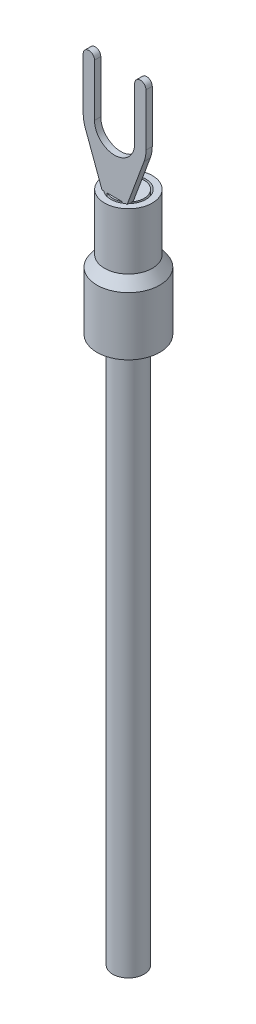
ISO-10303-21;
HEADER;
FILE_DESCRIPTION(('STEP AP214'),'2;1');
FILE_NAME('part.step','',(''),(''),'','','');
FILE_SCHEMA(('AUTOMOTIVE_DESIGN { 1 0 10303 214 1 1 1 1 }'));
ENDSEC;
DATA;
#1=APPLICATION_CONTEXT('core data for automotive mechanical design processes');
#2=APPLICATION_PROTOCOL_DEFINITION('international standard','automotive_design',2000,#1);
#3=PRODUCT_CONTEXT('',#1,'mechanical');
#4=PRODUCT('Part','Part','',(#3));
#5=PRODUCT_RELATED_PRODUCT_CATEGORY('part','',(#4));
#6=PRODUCT_DEFINITION_FORMATION('','',#4);
#7=PRODUCT_DEFINITION_CONTEXT('part definition',#1,'design');
#8=PRODUCT_DEFINITION('design','',#6,#7);
#9=PRODUCT_DEFINITION_SHAPE('','',#8);
#10=(LENGTH_UNIT() NAMED_UNIT(*) SI_UNIT(.MILLI.,.METRE.));
#11=(NAMED_UNIT(*) PLANE_ANGLE_UNIT() SI_UNIT($,.RADIAN.));
#12=(NAMED_UNIT(*) SI_UNIT($,.STERADIAN.) SOLID_ANGLE_UNIT());
#13=UNCERTAINTY_MEASURE_WITH_UNIT(LENGTH_MEASURE(1.E-05),#10,'distance_accuracy_value','');
#14=(GEOMETRIC_REPRESENTATION_CONTEXT(3) GLOBAL_UNCERTAINTY_ASSIGNED_CONTEXT((#13)) GLOBAL_UNIT_ASSIGNED_CONTEXT((#10,
#11,#12)) REPRESENTATION_CONTEXT('',''));
#15=CARTESIAN_POINT('',(0.,0.,0.));
#16=DIRECTION('',(0.,0.,1.));
#17=DIRECTION('',(1.,0.,0.));
#18=AXIS2_PLACEMENT_3D('',#15,#16,#17);
#19=CARTESIAN_POINT('',(-2.34452059505099,-0.867884312210892,0.5));
#20=DIRECTION('',(0.937808238020394,0.347153724884357,0.));
#21=DIRECTION('',(-0.347153724884357,0.937808238020394,0.));
#22=AXIS2_PLACEMENT_3D('',#19,#20,#21);
#23=PLANE('',#22);
#24=DIRECTION('',(0.,0.,1.));
#25=VECTOR('',#24,1.);
#26=CARTESIAN_POINT('',(-1.,-4.5,0.499999999999999));
#27=LINE('',#26,#25);
#28=CARTESIAN_POINT('',(-1.,-4.5,0.));
#29=VERTEX_POINT('',#28);
#30=CARTESIAN_POINT('',(-1.,-4.5,0.150000000000001));
#31=VERTEX_POINT('',#30);
#32=EDGE_CURVE('E185',#29,#31,#27,.T.);
#33=ORIENTED_EDGE('',*,*,#32,.T.);
#34=CARTESIAN_POINT('',(0.,-7.20142064105116,-0.6));
#35=DIRECTION('',(0.937808238020394,0.347153724884357,0.));
#36=DIRECTION('',(-0.347153724884357,0.937808238020394,0.));
#37=AXIS2_PLACEMENT_3D('',#34,#35,#36);
#38=ELLIPSE('',#37,3.60071032052557,1.25);
#39=CARTESIAN_POINT('',(-0.593717104351883,-5.59754100040986,0.500000000000003));
#40=VERTEX_POINT('',#39);
#41=EDGE_CURVE('E193',#31,#40,#38,.T.);
#42=ORIENTED_EDGE('',*,*,#41,.T.);
#43=DIRECTION('',(0.347153724884357,-0.937808238020394,0.));
#44=VECTOR('',#43,1.);
#45=CARTESIAN_POINT('',(-2.34452059505099,-0.867884312210892,0.5));
#46=LINE('',#45,#44);
#47=CARTESIAN_POINT('',(-0.866025403784439,-4.86192173959321,0.5));
#48=VERTEX_POINT('',#47);
#49=EDGE_CURVE('E273',#48,#40,#46,.T.);
#50=ORIENTED_EDGE('',*,*,#49,.F.);
#51=CARTESIAN_POINT('',(0.,-7.20142064105115,-0.6));
#52=DIRECTION('',(0.937808238020394,0.347153724884357,0.));
#53=DIRECTION('',(-0.347153724884357,0.937808238020394,0.));
#54=AXIS2_PLACEMENT_3D('',#51,#52,#53);
#55=ELLIPSE('',#54,4.03279555898864,1.4);
#56=CARTESIAN_POINT('',(-1.,-4.5,0.379795897113272));
#57=VERTEX_POINT('',#56);
#58=EDGE_CURVE('E55',#57,#48,#55,.T.);
#59=ORIENTED_EDGE('',*,*,#58,.F.);
#60=DIRECTION('',(0.,0.,-1.));
#61=VECTOR('',#60,1.);
#62=CARTESIAN_POINT('',(-1.,-4.5,0.499999999999999));
#63=LINE('',#62,#61);
#64=CARTESIAN_POINT('',(-1.,-4.5,0.5));
#65=VERTEX_POINT('',#64);
#66=EDGE_CURVE('E228',#65,#57,#63,.T.);
#67=ORIENTED_EDGE('',*,*,#66,.F.);
#68=CARTESIAN_POINT('',(-2.34452059505099,-0.867884312210892,0.5));
#69=VERTEX_POINT('',#68);
#70=EDGE_CURVE('E274',#69,#65,#46,.T.);
#71=ORIENTED_EDGE('',*,*,#70,.F.);
#72=DIRECTION('',(0.,0.,-1.));
#73=VECTOR('',#72,1.);
#74=CARTESIAN_POINT('',(-2.34452059505099,-0.867884312210892,0.5));
#75=LINE('',#74,#73);
#76=CARTESIAN_POINT('',(-2.34452059505099,-0.867884312210892,0.));
#77=VERTEX_POINT('',#76);
#78=EDGE_CURVE('E277',#69,#77,#75,.T.);
#79=ORIENTED_EDGE('',*,*,#78,.T.);
#80=DIRECTION('',(0.347153724884357,-0.937808238020394,0.));
#81=VECTOR('',#80,1.);
#82=CARTESIAN_POINT('',(-2.34452059505099,-0.867884312210892,0.));
#83=LINE('',#82,#81);
#84=EDGE_CURVE('E266',#77,#29,#83,.T.);
#85=ORIENTED_EDGE('',*,*,#84,.T.);
#86=EDGE_LOOP('',(#33,#42,#50,#59,#67,#71,#79,#85));
#87=FACE_BOUND('',#86,.T.);
#88=ADVANCED_FACE('F39',(#87),#23,.F.);
#89=CARTESIAN_POINT('',(0.,0.,0.5));
#90=DIRECTION('',(0.,0.,1.));
#91=DIRECTION('',(1.,0.,0.));
#92=AXIS2_PLACEMENT_3D('',#89,#90,#91);
#93=PLANE('',#92);
#94=DIRECTION('',(0.,1.,0.));
#95=VECTOR('',#94,1.);
#96=CARTESIAN_POINT('',(0.593717104351885,-58.,0.5));
#97=LINE('',#96,#95);
#98=CARTESIAN_POINT('',(0.593717104351896,-5.59754100040982,0.5));
#99=VERTEX_POINT('',#98);
#100=CARTESIAN_POINT('',(0.593717104351898,-4.5,0.5));
#101=VERTEX_POINT('',#100);
#102=EDGE_CURVE('E165',#99,#101,#97,.T.);
#103=ORIENTED_EDGE('',*,*,#102,.F.);
#104=DIRECTION('',(-0.347153724884357,-0.937808238020394,0.));
#105=VECTOR('',#104,1.);
#106=CARTESIAN_POINT('',(2.34452059505099,-0.867884312210892,0.5));
#107=LINE('',#106,#105);
#108=CARTESIAN_POINT('',(0.86602540378444,-4.86192173959321,0.5));
#109=VERTEX_POINT('',#108);
#110=EDGE_CURVE('E235',#109,#99,#107,.T.);
#111=ORIENTED_EDGE('',*,*,#110,.F.);
#112=DIRECTION('',(0.,1.,0.));
#113=VECTOR('',#112,1.);
#114=CARTESIAN_POINT('',(0.866025403784439,-5.56785615600206,0.5));
#115=LINE('',#114,#113);
#116=CARTESIAN_POINT('',(0.866025403784439,-4.5,0.5));
#117=VERTEX_POINT('',#116);
#118=EDGE_CURVE('E62',#109,#117,#115,.T.);
#119=ORIENTED_EDGE('',*,*,#118,.T.);
#120=DIRECTION('',(1.,0.,0.));
#121=VECTOR('',#120,1.);
#122=CARTESIAN_POINT('',(0.,-4.5,0.5));
#123=LINE('',#122,#121);
#124=CARTESIAN_POINT('',(1.,-4.5,0.5));
#125=VERTEX_POINT('',#124);
#126=EDGE_CURVE('E224',#117,#125,#123,.T.);
#127=ORIENTED_EDGE('',*,*,#126,.T.);
#128=CARTESIAN_POINT('',(2.34452059505099,-0.867884312210892,0.5));
#129=VERTEX_POINT('',#128);
#130=EDGE_CURVE('E231',#129,#125,#107,.T.);
#131=ORIENTED_EDGE('',*,*,#130,.F.);
#132=CARTESIAN_POINT('',(0.,0.,0.5));
#133=DIRECTION('',(0.,0.,-1.));
#134=DIRECTION('',(-1.,0.,0.));
#135=AXIS2_PLACEMENT_3D('',#132,#133,#134);
#136=CIRCLE('',#135,2.5);
#137=CARTESIAN_POINT('',(2.5,0.,0.5));
#138=VERTEX_POINT('',#137);
#139=EDGE_CURVE('E234',#138,#129,#136,.T.);
#140=ORIENTED_EDGE('',*,*,#139,.F.);
#141=DIRECTION('',(0.,-1.,0.));
#142=VECTOR('',#141,1.);
#143=CARTESIAN_POINT('',(2.5,0.,0.5));
#144=LINE('',#143,#142);
#145=CARTESIAN_POINT('',(2.5,4.15,0.5));
#146=VERTEX_POINT('',#145);
#147=EDGE_CURVE('E238',#146,#138,#144,.T.);
#148=ORIENTED_EDGE('',*,*,#147,.F.);
#149=CARTESIAN_POINT('',(2.05,4.15,0.5));
#150=DIRECTION('',(0.,0.,1.));
#151=DIRECTION('',(1.,0.,0.));
#152=AXIS2_PLACEMENT_3D('',#149,#150,#151);
#153=CIRCLE('',#152,0.45);
#154=CARTESIAN_POINT('',(1.6,4.15,0.5));
#155=VERTEX_POINT('',#154);
#156=EDGE_CURVE('E313',#146,#155,#153,.T.);
#157=ORIENTED_EDGE('',*,*,#156,.T.);
#158=DIRECTION('',(0.,1.,0.));
#159=VECTOR('',#158,1.);
#160=CARTESIAN_POINT('',(1.6,0.,0.5));
#161=LINE('',#160,#159);
#162=CARTESIAN_POINT('',(1.6,0.,0.5));
#163=VERTEX_POINT('',#162);
#164=EDGE_CURVE('E240',#163,#155,#161,.T.);
#165=ORIENTED_EDGE('',*,*,#164,.F.);
#166=CARTESIAN_POINT('',(0.,0.,0.5));
#167=DIRECTION('',(0.,0.,-1.));
#168=DIRECTION('',(1.,0.,0.));
#169=AXIS2_PLACEMENT_3D('',#166,#167,#168);
#170=CIRCLE('',#169,1.6);
#171=CARTESIAN_POINT('',(-1.6,0.,0.5));
#172=VERTEX_POINT('',#171);
#173=EDGE_CURVE('E262',#163,#172,#170,.T.);
#174=ORIENTED_EDGE('',*,*,#173,.T.);
#175=DIRECTION('',(0.,1.,0.));
#176=VECTOR('',#175,1.);
#177=CARTESIAN_POINT('',(-1.6,0.,0.5));
#178=LINE('',#177,#176);
#179=CARTESIAN_POINT('',(-1.6,4.15,0.5));
#180=VERTEX_POINT('',#179);
#181=EDGE_CURVE('E265',#172,#180,#178,.T.);
#182=ORIENTED_EDGE('',*,*,#181,.T.);
#183=CARTESIAN_POINT('',(-2.05,4.15,0.5));
#184=DIRECTION('',(0.,0.,1.));
#185=DIRECTION('',(1.,0.,0.));
#186=AXIS2_PLACEMENT_3D('',#183,#184,#185);
#187=CIRCLE('',#186,0.45);
#188=CARTESIAN_POINT('',(-2.5,4.15,0.5));
#189=VERTEX_POINT('',#188);
#190=EDGE_CURVE('E305',#180,#189,#187,.T.);
#191=ORIENTED_EDGE('',*,*,#190,.T.);
#192=DIRECTION('',(0.,-1.,0.));
#193=VECTOR('',#192,1.);
#194=CARTESIAN_POINT('',(-2.5,0.,0.5));
#195=LINE('',#194,#193);
#196=CARTESIAN_POINT('',(-2.5,0.,0.5));
#197=VERTEX_POINT('',#196);
#198=EDGE_CURVE('E269',#189,#197,#195,.T.);
#199=ORIENTED_EDGE('',*,*,#198,.T.);
#200=CARTESIAN_POINT('',(0.,0.,0.5));
#201=DIRECTION('',(0.,0.,1.));
#202=DIRECTION('',(1.,0.,0.));
#203=AXIS2_PLACEMENT_3D('',#200,#201,#202);
#204=CIRCLE('',#203,2.5);
#205=EDGE_CURVE('E271',#197,#69,#204,.T.);
#206=ORIENTED_EDGE('',*,*,#205,.T.);
#207=ORIENTED_EDGE('',*,*,#70,.T.);
#208=CARTESIAN_POINT('',(-0.866025403784439,-4.5,0.5));
#209=VERTEX_POINT('',#208);
#210=EDGE_CURVE('E227',#65,#209,#123,.T.);
#211=ORIENTED_EDGE('',*,*,#210,.T.);
#212=DIRECTION('',(0.,1.,0.));
#213=VECTOR('',#212,1.);
#214=CARTESIAN_POINT('',(-0.866025403784439,-5.56785615600206,0.5));
#215=LINE('',#214,#213);
#216=EDGE_CURVE('E221',#209,#48,#215,.F.);
#217=ORIENTED_EDGE('',*,*,#216,.T.);
#218=ORIENTED_EDGE('',*,*,#49,.T.);
#219=DIRECTION('',(0.,1.,0.));
#220=VECTOR('',#219,1.);
#221=CARTESIAN_POINT('',(-0.593717104351885,-58.,0.5));
#222=LINE('',#221,#220);
#223=CARTESIAN_POINT('',(-0.593717104351898,-4.5,0.5));
#224=VERTEX_POINT('',#223);
#225=EDGE_CURVE('E176',#224,#40,#222,.F.);
#226=ORIENTED_EDGE('',*,*,#225,.F.);
#227=DIRECTION('',(-1.,0.,0.));
#228=VECTOR('',#227,1.);
#229=CARTESIAN_POINT('',(0.,-4.5,0.5));
#230=LINE('',#229,#228);
#231=EDGE_CURVE('E177',#101,#224,#230,.T.);
#232=ORIENTED_EDGE('',*,*,#231,.F.);
#233=EDGE_LOOP('',(#103,#111,#119,#127,#131,#140,#148,#157,#165,#174,#182,#191,#199,#206,#207,
#211,#217,#218,#226,#232));
#234=FACE_BOUND('',#233,.T.);
#235=ADVANCED_FACE('F183',(#234),#93,.T.);
#236=CARTESIAN_POINT('',(2.34452059505099,-0.867884312210892,0.5));
#237=DIRECTION('',(0.937808238020394,-0.347153724884357,0.));
#238=DIRECTION('',(0.347153724884357,0.937808238020394,0.));
#239=AXIS2_PLACEMENT_3D('',#236,#237,#238);
#240=PLANE('',#239);
#241=CARTESIAN_POINT('',(0.,-7.20142064105116,-0.6));
#242=DIRECTION('',(0.937808238020394,-0.347153724884357,0.));
#243=DIRECTION('',(0.347153724884357,0.937808238020394,0.));
#244=AXIS2_PLACEMENT_3D('',#241,#242,#243);
#245=ELLIPSE('',#244,3.60071032052557,1.25);
#246=CARTESIAN_POINT('',(1.,-4.5,0.150000000000001));
#247=VERTEX_POINT('',#246);
#248=EDGE_CURVE('E11',#247,#99,#245,.T.);
#249=ORIENTED_EDGE('',*,*,#248,.F.);
#250=DIRECTION('',(0.,0.,1.));
#251=VECTOR('',#250,1.);
#252=CARTESIAN_POINT('',(1.,-4.5,0.499999999999999));
#253=LINE('',#252,#251);
#254=CARTESIAN_POINT('',(0.999999999999996,-4.5,0.));
#255=VERTEX_POINT('',#254);
#256=EDGE_CURVE('E188',#255,#247,#253,.T.);
#257=ORIENTED_EDGE('',*,*,#256,.F.);
#258=DIRECTION('',(-0.347153724884357,-0.937808238020394,0.));
#259=VECTOR('',#258,1.);
#260=CARTESIAN_POINT('',(2.34452059505099,-0.867884312210892,0.));
#261=LINE('',#260,#259);
#262=CARTESIAN_POINT('',(2.34452059505099,-0.867884312210892,0.));
#263=VERTEX_POINT('',#262);
#264=EDGE_CURVE('E230',#263,#255,#261,.T.);
#265=ORIENTED_EDGE('',*,*,#264,.F.);
#266=DIRECTION('',(0.,0.,-1.));
#267=VECTOR('',#266,1.);
#268=CARTESIAN_POINT('',(2.34452059505099,-0.867884312210892,0.5));
#269=LINE('',#268,#267);
#270=EDGE_CURVE('E259',#129,#263,#269,.T.);
#271=ORIENTED_EDGE('',*,*,#270,.F.);
#272=ORIENTED_EDGE('',*,*,#130,.T.);
#273=DIRECTION('',(0.,0.,-1.));
#274=VECTOR('',#273,1.);
#275=CARTESIAN_POINT('',(1.,-4.5,0.499999999999999));
#276=LINE('',#275,#274);
#277=CARTESIAN_POINT('',(1.,-4.5,0.379795897113272));
#278=VERTEX_POINT('',#277);
#279=EDGE_CURVE('E48',#125,#278,#276,.T.);
#280=ORIENTED_EDGE('',*,*,#279,.T.);
#281=CARTESIAN_POINT('',(0.,-7.20142064105115,-0.6));
#282=DIRECTION('',(0.937808238020394,-0.347153724884357,0.));
#283=DIRECTION('',(0.347153724884357,0.937808238020394,0.));
#284=AXIS2_PLACEMENT_3D('',#281,#282,#283);
#285=ELLIPSE('',#284,4.03279555898864,1.4);
#286=EDGE_CURVE('E317',#278,#109,#285,.T.);
#287=ORIENTED_EDGE('',*,*,#286,.T.);
#288=ORIENTED_EDGE('',*,*,#110,.T.);
#289=EDGE_LOOP('',(#249,#257,#265,#271,#272,#280,#287,#288));
#290=FACE_BOUND('',#289,.T.);
#291=ADVANCED_FACE('F320',(#290),#240,.T.);
#292=CARTESIAN_POINT('',(2.05,4.15,0.5));
#293=DIRECTION('',(0.,0.,-1.));
#294=DIRECTION('',(-1.,0.,0.));
#295=AXIS2_PLACEMENT_3D('',#292,#293,#294);
#296=CYLINDRICAL_SURFACE('',#295,0.45);
#297=DIRECTION('',(0.,0.,-1.));
#298=VECTOR('',#297,1.);
#299=CARTESIAN_POINT('',(1.6,4.15,0.5));
#300=LINE('',#299,#298);
#301=CARTESIAN_POINT('',(1.6,4.15,0.));
#302=VERTEX_POINT('',#301);
#303=EDGE_CURVE('E307',#155,#302,#300,.T.);
#304=ORIENTED_EDGE('',*,*,#303,.F.);
#305=ORIENTED_EDGE('',*,*,#156,.F.);
#306=DIRECTION('',(0.,0.,-1.));
#307=VECTOR('',#306,1.);
#308=CARTESIAN_POINT('',(2.5,4.15,0.5));
#309=LINE('',#308,#307);
#310=CARTESIAN_POINT('',(2.5,4.15,0.));
#311=VERTEX_POINT('',#310);
#312=EDGE_CURVE('E310',#311,#146,#309,.F.);
#313=ORIENTED_EDGE('',*,*,#312,.F.);
#314=CARTESIAN_POINT('',(2.05,4.15,0.));
#315=DIRECTION('',(0.,0.,1.));
#316=DIRECTION('',(1.,0.,0.));
#317=AXIS2_PLACEMENT_3D('',#314,#315,#316);
#318=CIRCLE('',#317,0.45);
#319=EDGE_CURVE('E315',#302,#311,#318,.F.);
#320=ORIENTED_EDGE('',*,*,#319,.F.);
#321=EDGE_LOOP('',(#304,#305,#313,#320));
#322=FACE_BOUND('',#321,.T.);
#323=ADVANCED_FACE('F42',(#322),#296,.T.);
#324=CARTESIAN_POINT('',(-2.05,4.15,0.));
#325=DIRECTION('',(0.,0.,-1.));
#326=DIRECTION('',(-1.,0.,0.));
#327=AXIS2_PLACEMENT_3D('',#324,#325,#326);
#328=CYLINDRICAL_SURFACE('',#327,0.45);
#329=DIRECTION('',(0.,0.,-1.));
#330=VECTOR('',#329,1.);
#331=CARTESIAN_POINT('',(-1.6,4.15,0.5));
#332=LINE('',#331,#330);
#333=CARTESIAN_POINT('',(-1.6,4.15,0.));
#334=VERTEX_POINT('',#333);
#335=EDGE_CURVE('E297',#334,#180,#332,.F.);
#336=ORIENTED_EDGE('',*,*,#335,.F.);
#337=CARTESIAN_POINT('',(-2.05,4.15,0.));
#338=DIRECTION('',(0.,0.,1.));
#339=DIRECTION('',(1.,0.,0.));
#340=AXIS2_PLACEMENT_3D('',#337,#338,#339);
#341=CIRCLE('',#340,0.45);
#342=CARTESIAN_POINT('',(-2.5,4.15,0.));
#343=VERTEX_POINT('',#342);
#344=EDGE_CURVE('E303',#343,#334,#341,.F.);
#345=ORIENTED_EDGE('',*,*,#344,.F.);
#346=DIRECTION('',(0.,0.,-1.));
#347=VECTOR('',#346,1.);
#348=CARTESIAN_POINT('',(-2.5,4.15,0.5));
#349=LINE('',#348,#347);
#350=EDGE_CURVE('E300',#189,#343,#349,.T.);
#351=ORIENTED_EDGE('',*,*,#350,.F.);
#352=ORIENTED_EDGE('',*,*,#190,.F.);
#353=EDGE_LOOP('',(#336,#345,#351,#352));
#354=FACE_BOUND('',#353,.T.);
#355=ADVANCED_FACE('F359',(#354),#328,.T.);
#356=CARTESIAN_POINT('',(0.,0.,0.5));
#357=DIRECTION('',(0.,0.,-1.));
#358=DIRECTION('',(-1.,0.,0.));
#359=AXIS2_PLACEMENT_3D('',#356,#357,#358);
#360=CYLINDRICAL_SURFACE('',#359,1.6);
#361=CARTESIAN_POINT('',(0.,0.,0.));
#362=DIRECTION('',(0.,0.,-1.));
#363=DIRECTION('',(1.,0.,0.));
#364=AXIS2_PLACEMENT_3D('',#361,#362,#363);
#365=CIRCLE('',#364,1.6);
#366=CARTESIAN_POINT('',(1.6,0.,0.));
#367=VERTEX_POINT('',#366);
#368=CARTESIAN_POINT('',(-1.6,0.,0.));
#369=VERTEX_POINT('',#368);
#370=EDGE_CURVE('E261',#367,#369,#365,.T.);
#371=ORIENTED_EDGE('',*,*,#370,.T.);
#372=DIRECTION('',(0.,0.,-1.));
#373=VECTOR('',#372,1.);
#374=CARTESIAN_POINT('',(-1.6,0.,0.5));
#375=LINE('',#374,#373);
#376=EDGE_CURVE('E294',#172,#369,#375,.T.);
#377=ORIENTED_EDGE('',*,*,#376,.F.);
#378=ORIENTED_EDGE('',*,*,#173,.F.);
#379=DIRECTION('',(0.,0.,-1.));
#380=VECTOR('',#379,1.);
#381=CARTESIAN_POINT('',(1.6,0.,0.5));
#382=LINE('',#381,#380);
#383=EDGE_CURVE('E243',#163,#367,#382,.T.);
#384=ORIENTED_EDGE('',*,*,#383,.T.);
#385=EDGE_LOOP('',(#371,#377,#378,#384));
#386=FACE_BOUND('',#385,.T.);
#387=ADVANCED_FACE('F354',(#386),#360,.F.);
#388=CARTESIAN_POINT('',(-1.6,0.,0.5));
#389=DIRECTION('',(-1.,0.,0.));
#390=DIRECTION('',(0.,0.,1.));
#391=AXIS2_PLACEMENT_3D('',#388,#389,#390);
#392=PLANE('',#391);
#393=DIRECTION('',(0.,1.,0.));
#394=VECTOR('',#393,1.);
#395=CARTESIAN_POINT('',(-1.6,0.,0.));
#396=LINE('',#395,#394);
#397=EDGE_CURVE('E280',#369,#334,#396,.T.);
#398=ORIENTED_EDGE('',*,*,#397,.T.);
#399=ORIENTED_EDGE('',*,*,#335,.T.);
#400=ORIENTED_EDGE('',*,*,#181,.F.);
#401=ORIENTED_EDGE('',*,*,#376,.T.);
#402=EDGE_LOOP('',(#398,#399,#400,#401));
#403=FACE_BOUND('',#402,.T.);
#404=ADVANCED_FACE('F356',(#403),#392,.F.);
#405=CARTESIAN_POINT('',(-2.5,0.,0.5));
#406=DIRECTION('',(1.,0.,0.));
#407=DIRECTION('',(0.,0.,-1.));
#408=AXIS2_PLACEMENT_3D('',#405,#406,#407);
#409=PLANE('',#408);
#410=ORIENTED_EDGE('',*,*,#198,.F.);
#411=ORIENTED_EDGE('',*,*,#350,.T.);
#412=DIRECTION('',(0.,-1.,0.));
#413=VECTOR('',#412,1.);
#414=CARTESIAN_POINT('',(-2.5,0.,0.));
#415=LINE('',#414,#413);
#416=CARTESIAN_POINT('',(-2.5,0.,0.));
#417=VERTEX_POINT('',#416);
#418=EDGE_CURVE('E283',#343,#417,#415,.T.);
#419=ORIENTED_EDGE('',*,*,#418,.T.);
#420=DIRECTION('',(0.,0.,-1.));
#421=VECTOR('',#420,1.);
#422=CARTESIAN_POINT('',(-2.5,0.,0.5));
#423=LINE('',#422,#421);
#424=EDGE_CURVE('E291',#197,#417,#423,.T.);
#425=ORIENTED_EDGE('',*,*,#424,.F.);
#426=EDGE_LOOP('',(#410,#411,#419,#425));
#427=FACE_BOUND('',#426,.T.);
#428=ADVANCED_FACE('F366',(#427),#409,.F.);
#429=CARTESIAN_POINT('',(0.,0.,0.5));
#430=DIRECTION('',(0.,0.,-1.));
#431=DIRECTION('',(-1.,0.,0.));
#432=AXIS2_PLACEMENT_3D('',#429,#430,#431);
#433=CYLINDRICAL_SURFACE('',#432,2.5);
#434=CARTESIAN_POINT('',(0.,0.,0.));
#435=DIRECTION('',(0.,0.,1.));
#436=DIRECTION('',(1.,0.,0.));
#437=AXIS2_PLACEMENT_3D('',#434,#435,#436);
#438=CIRCLE('',#437,2.5);
#439=EDGE_CURVE('E285',#417,#77,#438,.T.);
#440=ORIENTED_EDGE('',*,*,#439,.T.);
#441=ORIENTED_EDGE('',*,*,#78,.F.);
#442=ORIENTED_EDGE('',*,*,#205,.F.);
#443=ORIENTED_EDGE('',*,*,#424,.T.);
#444=EDGE_LOOP('',(#440,#441,#442,#443));
#445=FACE_BOUND('',#444,.T.);
#446=ADVANCED_FACE('F370',(#445),#433,.T.);
#447=CARTESIAN_POINT('',(0.,0.,0.));
#448=DIRECTION('',(0.,0.,1.));
#449=DIRECTION('',(1.,0.,0.));
#450=AXIS2_PLACEMENT_3D('',#447,#448,#449);
#451=PLANE('',#450);
#452=ORIENTED_EDGE('',*,*,#264,.T.);
#453=DIRECTION('',(-1.,0.,0.));
#454=VECTOR('',#453,1.);
#455=CARTESIAN_POINT('',(0.,-4.5,0.));
#456=LINE('',#455,#454);
#457=EDGE_CURVE('E331',#255,#29,#456,.T.);
#458=ORIENTED_EDGE('',*,*,#457,.T.);
#459=ORIENTED_EDGE('',*,*,#84,.F.);
#460=ORIENTED_EDGE('',*,*,#439,.F.);
#461=ORIENTED_EDGE('',*,*,#418,.F.);
#462=ORIENTED_EDGE('',*,*,#344,.T.);
#463=ORIENTED_EDGE('',*,*,#397,.F.);
#464=ORIENTED_EDGE('',*,*,#370,.F.);
#465=DIRECTION('',(0.,1.,0.));
#466=VECTOR('',#465,1.);
#467=CARTESIAN_POINT('',(1.6,0.,0.));
#468=LINE('',#467,#466);
#469=EDGE_CURVE('E251',#367,#302,#468,.T.);
#470=ORIENTED_EDGE('',*,*,#469,.T.);
#471=ORIENTED_EDGE('',*,*,#319,.T.);
#472=DIRECTION('',(0.,-1.,0.));
#473=VECTOR('',#472,1.);
#474=CARTESIAN_POINT('',(2.5,0.,0.));
#475=LINE('',#474,#473);
#476=CARTESIAN_POINT('',(2.5,0.,0.));
#477=VERTEX_POINT('',#476);
#478=EDGE_CURVE('E249',#311,#477,#475,.T.);
#479=ORIENTED_EDGE('',*,*,#478,.T.);
#480=CARTESIAN_POINT('',(0.,0.,0.));
#481=DIRECTION('',(0.,0.,-1.));
#482=DIRECTION('',(-1.,0.,0.));
#483=AXIS2_PLACEMENT_3D('',#480,#481,#482);
#484=CIRCLE('',#483,2.5);
#485=EDGE_CURVE('E246',#477,#263,#484,.T.);
#486=ORIENTED_EDGE('',*,*,#485,.T.);
#487=EDGE_LOOP('',(#452,#458,#459,#460,#461,#462,#463,#464,#470,#471,#479,#486));
#488=FACE_BOUND('',#487,.T.);
#489=ADVANCED_FACE('F334',(#488),#451,.F.);
#490=CARTESIAN_POINT('',(0.,0.,0.5));
#491=DIRECTION('',(0.,0.,-1.));
#492=DIRECTION('',(-1.,0.,0.));
#493=AXIS2_PLACEMENT_3D('',#490,#491,#492);
#494=CYLINDRICAL_SURFACE('',#493,2.5);
#495=ORIENTED_EDGE('',*,*,#485,.F.);
#496=DIRECTION('',(0.,0.,-1.));
#497=VECTOR('',#496,1.);
#498=CARTESIAN_POINT('',(2.5,0.,0.5));
#499=LINE('',#498,#497);
#500=EDGE_CURVE('E256',#138,#477,#499,.T.);
#501=ORIENTED_EDGE('',*,*,#500,.F.);
#502=ORIENTED_EDGE('',*,*,#139,.T.);
#503=ORIENTED_EDGE('',*,*,#270,.T.);
#504=EDGE_LOOP('',(#495,#501,#502,#503));
#505=FACE_BOUND('',#504,.T.);
#506=ADVANCED_FACE('F340',(#505),#494,.T.);
#507=CARTESIAN_POINT('',(2.5,0.,0.5));
#508=DIRECTION('',(1.,0.,0.));
#509=DIRECTION('',(0.,0.,-1.));
#510=AXIS2_PLACEMENT_3D('',#507,#508,#509);
#511=PLANE('',#510);
#512=ORIENTED_EDGE('',*,*,#478,.F.);
#513=ORIENTED_EDGE('',*,*,#312,.T.);
#514=ORIENTED_EDGE('',*,*,#147,.T.);
#515=ORIENTED_EDGE('',*,*,#500,.T.);
#516=EDGE_LOOP('',(#512,#513,#514,#515));
#517=FACE_BOUND('',#516,.T.);
#518=ADVANCED_FACE('F345',(#517),#511,.T.);
#519=CARTESIAN_POINT('',(1.6,0.,0.5));
#520=DIRECTION('',(-1.,0.,0.));
#521=DIRECTION('',(0.,0.,1.));
#522=AXIS2_PLACEMENT_3D('',#519,#520,#521);
#523=PLANE('',#522);
#524=ORIENTED_EDGE('',*,*,#164,.T.);
#525=ORIENTED_EDGE('',*,*,#303,.T.);
#526=ORIENTED_EDGE('',*,*,#469,.F.);
#527=ORIENTED_EDGE('',*,*,#383,.F.);
#528=EDGE_LOOP('',(#524,#525,#526,#527));
#529=FACE_BOUND('',#528,.T.);
#530=ADVANCED_FACE('F351',(#529),#523,.T.);
#531=CARTESIAN_POINT('',(0.,-4.5,-2.5));
#532=DIRECTION('',(0.,-1.,0.));
#533=DIRECTION('',(0.,0.,-1.));
#534=AXIS2_PLACEMENT_3D('',#531,#532,#533);
#535=PLANE('',#534);
#536=CARTESIAN_POINT('',(0.,-4.5,-0.599999999999999));
#537=DIRECTION('',(0.,1.,0.));
#538=DIRECTION('',(0.,0.,1.));
#539=AXIS2_PLACEMENT_3D('',#536,#537,#538);
#540=CIRCLE('',#539,1.9);
#541=CARTESIAN_POINT('',(0.,-4.5,1.3));
#542=VERTEX_POINT('',#541);
#543=EDGE_CURVE('E196',#542,#542,#540,.T.);
#544=ORIENTED_EDGE('',*,*,#543,.T.);
#545=EDGE_LOOP('',(#544));
#546=FACE_BOUND('',#545,.T.);
#547=ORIENTED_EDGE('',*,*,#210,.F.);
#548=ORIENTED_EDGE('',*,*,#66,.T.);
#549=CARTESIAN_POINT('',(0.,-4.5,-0.599999999999999));
#550=DIRECTION('',(0.,1.,0.));
#551=DIRECTION('',(0.,0.,1.));
#552=AXIS2_PLACEMENT_3D('',#549,#550,#551);
#553=CIRCLE('',#552,1.4);
#554=EDGE_CURVE('E219',#278,#57,#553,.T.);
#555=ORIENTED_EDGE('',*,*,#554,.F.);
#556=ORIENTED_EDGE('',*,*,#279,.F.);
#557=ORIENTED_EDGE('',*,*,#126,.F.);
#558=EDGE_CURVE('E217',#209,#117,#553,.T.);
#559=ORIENTED_EDGE('',*,*,#558,.F.);
#560=EDGE_LOOP('',(#547,#548,#555,#556,#557,#559));
#561=FACE_BOUND('',#560,.T.);
#562=ADVANCED_FACE('F324',(#546,#561),#535,.F.);
#563=CARTESIAN_POINT('',(0.,-5.56785615600206,-0.599999999999999));
#564=DIRECTION('',(0.,1.,0.));
#565=DIRECTION('',(0.,0.,1.));
#566=AXIS2_PLACEMENT_3D('',#563,#564,#565);
#567=CYLINDRICAL_SURFACE('',#566,1.4);
#568=CARTESIAN_POINT('',(0.,-9.1616925927975,-0.6));
#569=DIRECTION('',(0.,1.,0.));
#570=DIRECTION('',(0.,0.,1.));
#571=AXIS2_PLACEMENT_3D('',#568,#569,#570);
#572=CIRCLE('',#571,1.4);
#573=CARTESIAN_POINT('',(0.,-9.1616925927975,0.8));
#574=VERTEX_POINT('',#573);
#575=EDGE_CURVE('E214',#574,#574,#572,.T.);
#576=ORIENTED_EDGE('',*,*,#575,.F.);
#577=EDGE_LOOP('',(#576));
#578=FACE_BOUND('',#577,.T.);
#579=ORIENTED_EDGE('',*,*,#554,.T.);
#580=ORIENTED_EDGE('',*,*,#58,.T.);
#581=ORIENTED_EDGE('',*,*,#216,.F.);
#582=ORIENTED_EDGE('',*,*,#558,.T.);
#583=ORIENTED_EDGE('',*,*,#118,.F.);
#584=ORIENTED_EDGE('',*,*,#286,.F.);
#585=EDGE_LOOP('',(#579,#580,#581,#582,#583,#584));
#586=FACE_BOUND('',#585,.T.);
#587=ADVANCED_FACE('F376',(#578,#586),#567,.F.);
#588=CARTESIAN_POINT('',(0.,-9.1616925927975,-0.6));
#589=DIRECTION('',(0.,-1.,0.));
#590=DIRECTION('',(0.,0.,-1.));
#591=AXIS2_PLACEMENT_3D('',#588,#589,#590);
#592=CONICAL_SURFACE('',#591,1.4,0.610865238198019);
#593=CARTESIAN_POINT('',(0.,-10.0185813968428,-0.6));
#594=DIRECTION('',(0.,1.,0.));
#595=DIRECTION('',(0.,0.,1.));
#596=AXIS2_PLACEMENT_3D('',#593,#594,#595);
#597=CIRCLE('',#596,2.);
#598=CARTESIAN_POINT('',(0.,-10.0185813968428,1.4));
#599=VERTEX_POINT('',#598);
#600=EDGE_CURVE('E211',#599,#599,#597,.T.);
#601=ORIENTED_EDGE('',*,*,#600,.F.);
#602=EDGE_LOOP('',(#601));
#603=FACE_BOUND('',#602,.T.);
#604=ORIENTED_EDGE('',*,*,#575,.T.);
#605=EDGE_LOOP('',(#604));
#606=FACE_BOUND('',#605,.T.);
#607=ADVANCED_FACE('F378',(#603,#606),#592,.F.);
#608=CARTESIAN_POINT('',(0.,-5.56785615600206,-0.599999999999999));
#609=DIRECTION('',(0.,1.,0.));
#610=DIRECTION('',(0.,0.,1.));
#611=AXIS2_PLACEMENT_3D('',#608,#609,#610);
#612=CYLINDRICAL_SURFACE('',#611,2.);
#613=CARTESIAN_POINT('',(0.,-14.5,-0.6));
#614=DIRECTION('',(0.,1.,0.));
#615=DIRECTION('',(0.,0.,1.));
#616=AXIS2_PLACEMENT_3D('',#613,#614,#615);
#617=CIRCLE('',#616,2.);
#618=CARTESIAN_POINT('',(0.,-14.5,1.4));
#619=VERTEX_POINT('',#618);
#620=EDGE_CURVE('E208',#619,#619,#617,.T.);
#621=ORIENTED_EDGE('',*,*,#620,.F.);
#622=EDGE_LOOP('',(#621));
#623=FACE_BOUND('',#622,.T.);
#624=ORIENTED_EDGE('',*,*,#600,.T.);
#625=EDGE_LOOP('',(#624));
#626=FACE_BOUND('',#625,.T.);
#627=ADVANCED_FACE('F385',(#623,#626),#612,.F.);
#628=CARTESIAN_POINT('',(0.,-14.5,-3.1));
#629=DIRECTION('',(0.,1.,0.));
#630=DIRECTION('',(0.,0.,1.));
#631=AXIS2_PLACEMENT_3D('',#628,#629,#630);
#632=PLANE('',#631);
#633=CARTESIAN_POINT('',(0.,-14.5,-0.6));
#634=DIRECTION('',(0.,1.,0.));
#635=DIRECTION('',(0.,0.,1.));
#636=AXIS2_PLACEMENT_3D('',#633,#634,#635);
#637=CIRCLE('',#636,2.5);
#638=CARTESIAN_POINT('',(0.,-14.5,1.9));
#639=VERTEX_POINT('',#638);
#640=EDGE_CURVE('E205',#639,#639,#637,.T.);
#641=ORIENTED_EDGE('',*,*,#640,.F.);
#642=EDGE_LOOP('',(#641));
#643=FACE_BOUND('',#642,.T.);
#644=ORIENTED_EDGE('',*,*,#620,.T.);
#645=EDGE_LOOP('',(#644));
#646=FACE_BOUND('',#645,.T.);
#647=ADVANCED_FACE('F456',(#643,#646),#632,.F.);
#648=CARTESIAN_POINT('',(0.,-5.56785615600206,-0.599999999999999));
#649=DIRECTION('',(0.,1.,0.));
#650=DIRECTION('',(0.,0.,1.));
#651=AXIS2_PLACEMENT_3D('',#648,#649,#650);
#652=CYLINDRICAL_SURFACE('',#651,2.5);
#653=CARTESIAN_POINT('',(0.,-9.86093200240327,-0.6));
#654=DIRECTION('',(0.,1.,0.));
#655=DIRECTION('',(0.,0.,1.));
#656=AXIS2_PLACEMENT_3D('',#653,#654,#655);
#657=CIRCLE('',#656,2.5);
#658=CARTESIAN_POINT('',(0.,-9.86093200240327,1.9));
#659=VERTEX_POINT('',#658);
#660=EDGE_CURVE('E202',#659,#659,#657,.T.);
#661=ORIENTED_EDGE('',*,*,#660,.F.);
#662=EDGE_LOOP('',(#661));
#663=FACE_BOUND('',#662,.T.);
#664=ORIENTED_EDGE('',*,*,#640,.T.);
#665=EDGE_LOOP('',(#664));
#666=FACE_BOUND('',#665,.T.);
#667=ADVANCED_FACE('F466',(#663,#666),#652,.T.);
#668=CARTESIAN_POINT('',(0.,-9.86093200240327,-0.6));
#669=DIRECTION('',(0.,-1.,0.));
#670=DIRECTION('',(0.,0.,-1.));
#671=AXIS2_PLACEMENT_3D('',#668,#669,#670);
#672=CONICAL_SURFACE('',#671,2.5,0.610865238198019);
#673=CARTESIAN_POINT('',(0.,-9.004043198358,-0.6));
#674=DIRECTION('',(0.,1.,0.));
#675=DIRECTION('',(0.,0.,1.));
#676=AXIS2_PLACEMENT_3D('',#673,#674,#675);
#677=CIRCLE('',#676,1.9);
#678=CARTESIAN_POINT('',(0.,-9.004043198358,1.3));
#679=VERTEX_POINT('',#678);
#680=EDGE_CURVE('E199',#679,#679,#677,.T.);
#681=ORIENTED_EDGE('',*,*,#680,.F.);
#682=EDGE_LOOP('',(#681));
#683=FACE_BOUND('',#682,.T.);
#684=ORIENTED_EDGE('',*,*,#660,.T.);
#685=EDGE_LOOP('',(#684));
#686=FACE_BOUND('',#685,.T.);
#687=ADVANCED_FACE('F476',(#683,#686),#672,.T.);
#688=CARTESIAN_POINT('',(0.,-5.56785615600206,-0.599999999999999));
#689=DIRECTION('',(0.,1.,0.));
#690=DIRECTION('',(0.,0.,1.));
#691=AXIS2_PLACEMENT_3D('',#688,#689,#690);
#692=CYLINDRICAL_SURFACE('',#691,1.9);
#693=ORIENTED_EDGE('',*,*,#543,.F.);
#694=EDGE_LOOP('',(#693));
#695=FACE_BOUND('',#694,.T.);
#696=ORIENTED_EDGE('',*,*,#680,.T.);
#697=EDGE_LOOP('',(#696));
#698=FACE_BOUND('',#697,.T.);
#699=ADVANCED_FACE('F486',(#695,#698),#692,.T.);
#700=CARTESIAN_POINT('',(0.,-58.,-0.600000000000006));
#701=DIRECTION('',(0.,1.,0.));
#702=DIRECTION('',(0.,0.,1.));
#703=AXIS2_PLACEMENT_3D('',#700,#701,#702);
#704=CYLINDRICAL_SURFACE('',#703,1.25);
#705=CARTESIAN_POINT('',(0.,-58.,-0.600000000000006));
#706=DIRECTION('',(0.,1.,0.));
#707=DIRECTION('',(0.,0.,1.));
#708=AXIS2_PLACEMENT_3D('',#705,#706,#707);
#709=CIRCLE('',#708,1.25);
#710=CARTESIAN_POINT('',(0.,-58.,0.649999999999994));
#711=VERTEX_POINT('',#710);
#712=EDGE_CURVE('E565',#711,#711,#709,.T.);
#713=ORIENTED_EDGE('',*,*,#712,.T.);
#714=EDGE_LOOP('',(#713));
#715=FACE_BOUND('',#714,.T.);
#716=ORIENTED_EDGE('',*,*,#41,.F.);
#717=CARTESIAN_POINT('',(0.,-4.5,-0.599999999999999));
#718=DIRECTION('',(0.,1.,0.));
#719=DIRECTION('',(0.,0.,1.));
#720=AXIS2_PLACEMENT_3D('',#717,#718,#719);
#721=CIRCLE('',#720,1.25);
#722=EDGE_CURVE('E181',#247,#31,#721,.T.);
#723=ORIENTED_EDGE('',*,*,#722,.F.);
#724=ORIENTED_EDGE('',*,*,#248,.T.);
#725=ORIENTED_EDGE('',*,*,#102,.T.);
#726=EDGE_CURVE('E168',#224,#101,#721,.T.);
#727=ORIENTED_EDGE('',*,*,#726,.F.);
#728=ORIENTED_EDGE('',*,*,#225,.T.);
#729=EDGE_LOOP('',(#716,#723,#724,#725,#727,#728));
#730=FACE_BOUND('',#729,.T.);
#731=ADVANCED_FACE('F167',(#715,#730),#704,.T.);
#732=CARTESIAN_POINT('',(0.,-4.5,-0.599999999999999));
#733=DIRECTION('',(0.,1.,0.));
#734=DIRECTION('',(0.,0.,1.));
#735=AXIS2_PLACEMENT_3D('',#732,#733,#734);
#736=PLANE('',#735);
#737=ORIENTED_EDGE('',*,*,#32,.F.);
#738=ORIENTED_EDGE('',*,*,#457,.F.);
#739=ORIENTED_EDGE('',*,*,#256,.T.);
#740=ORIENTED_EDGE('',*,*,#722,.T.);
#741=EDGE_LOOP('',(#737,#738,#739,#740));
#742=FACE_BOUND('',#741,.T.);
#743=ADVANCED_FACE('F533',(#742),#736,.T.);
#744=CARTESIAN_POINT('',(0.,-58.,-0.600000000000006));
#745=DIRECTION('',(0.,1.,0.));
#746=DIRECTION('',(0.,0.,1.));
#747=AXIS2_PLACEMENT_3D('',#744,#745,#746);
#748=PLANE('',#747);
#749=ORIENTED_EDGE('',*,*,#712,.F.);
#750=EDGE_LOOP('',(#749));
#751=FACE_BOUND('',#750,.T.);
#752=ADVANCED_FACE('F543',(#751),#748,.F.);
#753=ORIENTED_EDGE('',*,*,#726,.T.);
#754=ORIENTED_EDGE('',*,*,#231,.T.);
#755=EDGE_LOOP('',(#753,#754));
#756=FACE_BOUND('',#755,.T.);
#757=ADVANCED_FACE('F180',(#756),#736,.T.);
#758=CLOSED_SHELL('',(#88,#235,#291,#323,#355,#387,#404,#428,#446,#489,#506,#518,#530,#562,#587,
#607,#627,#647,#667,#687,#699,#731,#743,#752,#757));
#759=MANIFOLD_SOLID_BREP('B2',#758);
#760=ADVANCED_BREP_SHAPE_REPRESENTATION('',(#18,#759),#14);
#761=SHAPE_DEFINITION_REPRESENTATION(#9,#760);
ENDSEC;
END-ISO-10303-21;
